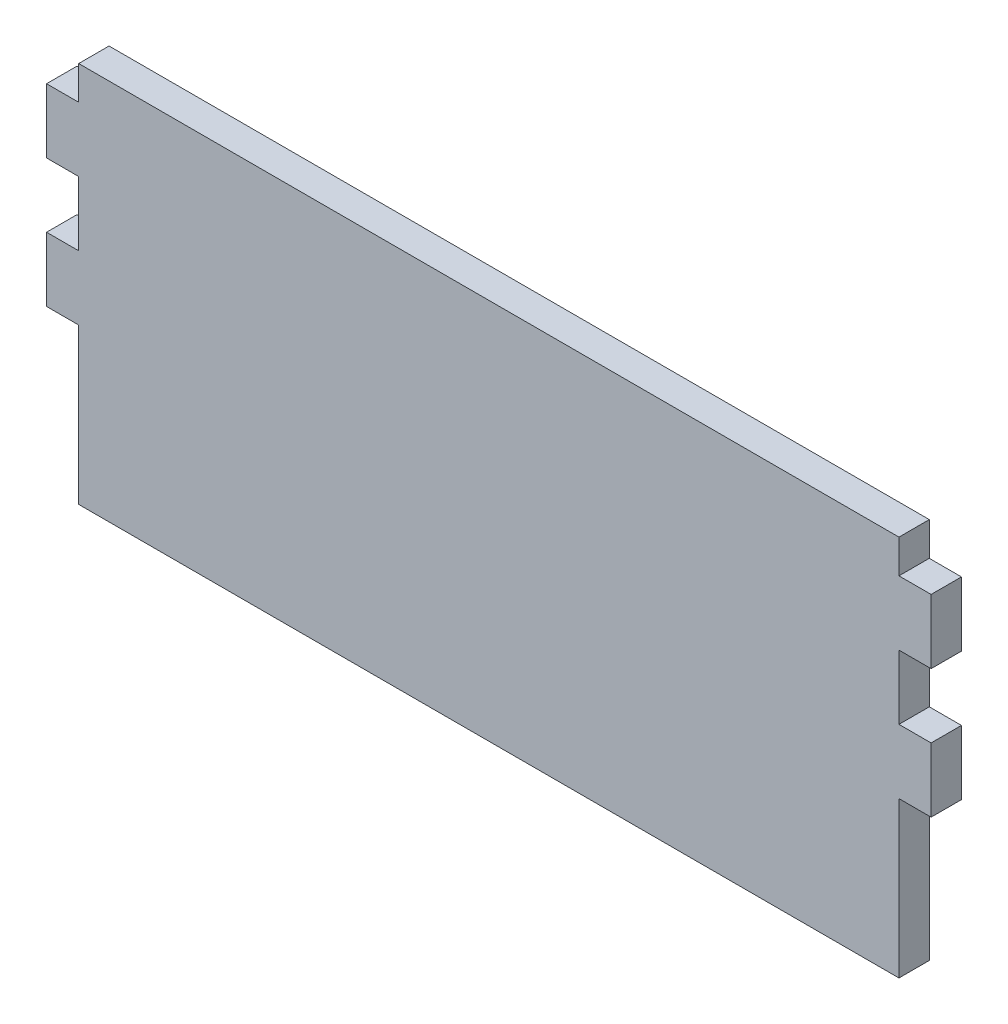
ISO-10303-21;
HEADER;
FILE_DESCRIPTION(('STEP AP214'),'2;1');
FILE_NAME('part.step','',(''),(''),'','','');
FILE_SCHEMA(('AUTOMOTIVE_DESIGN { 1 0 10303 214 1 1 1 1 }'));
ENDSEC;
DATA;
#1=APPLICATION_CONTEXT('core data for automotive mechanical design processes');
#2=APPLICATION_PROTOCOL_DEFINITION('international standard','automotive_design',2000,#1);
#3=PRODUCT_CONTEXT('',#1,'mechanical');
#4=PRODUCT('Part','Part','',(#3));
#5=PRODUCT_RELATED_PRODUCT_CATEGORY('part','',(#4));
#6=PRODUCT_DEFINITION_FORMATION('','',#4);
#7=PRODUCT_DEFINITION_CONTEXT('part definition',#1,'design');
#8=PRODUCT_DEFINITION('design','',#6,#7);
#9=PRODUCT_DEFINITION_SHAPE('','',#8);
#10=(LENGTH_UNIT() NAMED_UNIT(*) SI_UNIT(.MILLI.,.METRE.));
#11=(NAMED_UNIT(*) PLANE_ANGLE_UNIT() SI_UNIT($,.RADIAN.));
#12=(NAMED_UNIT(*) SI_UNIT($,.STERADIAN.) SOLID_ANGLE_UNIT());
#13=UNCERTAINTY_MEASURE_WITH_UNIT(LENGTH_MEASURE(1.E-05),#10,'distance_accuracy_value','');
#14=(GEOMETRIC_REPRESENTATION_CONTEXT(3) GLOBAL_UNCERTAINTY_ASSIGNED_CONTEXT((#13)) GLOBAL_UNIT_ASSIGNED_CONTEXT((#10,
#11,#12)) REPRESENTATION_CONTEXT('',''));
#15=CARTESIAN_POINT('',(0.,0.,0.));
#16=DIRECTION('',(0.,0.,1.));
#17=DIRECTION('',(1.,0.,0.));
#18=AXIS2_PLACEMENT_3D('',#15,#16,#17);
#19=CARTESIAN_POINT('',(81.,0.,2.9972));
#20=DIRECTION('',(0.,1.,0.));
#21=DIRECTION('',(0.,0.,1.));
#22=AXIS2_PLACEMENT_3D('',#19,#20,#21);
#23=PLANE('',#22);
#24=DIRECTION('',(1.,0.,0.));
#25=VECTOR('',#24,1.);
#26=CARTESIAN_POINT('',(81.,0.,0.));
#27=LINE('',#26,#25);
#28=CARTESIAN_POINT('',(0.,0.,0.));
#29=VERTEX_POINT('',#28);
#30=CARTESIAN_POINT('',(81.,0.,0.));
#31=VERTEX_POINT('',#30);
#32=EDGE_CURVE('E201',#29,#31,#27,.T.);
#33=ORIENTED_EDGE('',*,*,#32,.T.);
#34=DIRECTION('',(0.,0.,-1.));
#35=VECTOR('',#34,1.);
#36=CARTESIAN_POINT('',(81.,0.,2.9972));
#37=LINE('',#36,#35);
#38=CARTESIAN_POINT('',(81.,0.,2.9972));
#39=VERTEX_POINT('',#38);
#40=EDGE_CURVE('E11',#39,#31,#37,.T.);
#41=ORIENTED_EDGE('',*,*,#40,.F.);
#42=DIRECTION('',(1.,0.,0.));
#43=VECTOR('',#42,1.);
#44=CARTESIAN_POINT('',(81.,0.,2.9972));
#45=LINE('',#44,#43);
#46=CARTESIAN_POINT('',(0.,0.,2.9972));
#47=VERTEX_POINT('',#46);
#48=EDGE_CURVE('E239',#47,#39,#45,.T.);
#49=ORIENTED_EDGE('',*,*,#48,.F.);
#50=DIRECTION('',(0.,0.,-1.));
#51=VECTOR('',#50,1.);
#52=CARTESIAN_POINT('',(0.,0.,2.9972));
#53=LINE('',#52,#51);
#54=EDGE_CURVE('E197',#47,#29,#53,.T.);
#55=ORIENTED_EDGE('',*,*,#54,.T.);
#56=EDGE_LOOP('',(#33,#41,#49,#55));
#57=FACE_BOUND('',#56,.T.);
#58=ADVANCED_FACE('F33',(#57),#23,.F.);
#59=CARTESIAN_POINT('',(81.,0.,2.9972));
#60=DIRECTION('',(-1.,0.,0.));
#61=DIRECTION('',(0.,-1.,0.));
#62=AXIS2_PLACEMENT_3D('',#59,#60,#61);
#63=PLANE('',#62);
#64=DIRECTION('',(0.,1.,0.));
#65=VECTOR('',#64,1.);
#66=CARTESIAN_POINT('',(81.,0.,0.));
#67=LINE('',#66,#65);
#68=CARTESIAN_POINT('',(81.,15.3413028,0.));
#69=VERTEX_POINT('',#68);
#70=EDGE_CURVE('E204',#31,#69,#67,.T.);
#71=ORIENTED_EDGE('',*,*,#70,.T.);
#72=DIRECTION('',(0.,0.,-1.));
#73=VECTOR('',#72,1.);
#74=CARTESIAN_POINT('',(81.,15.3413028,2.9972));
#75=LINE('',#74,#73);
#76=CARTESIAN_POINT('',(81.,15.3413028,2.9972));
#77=VERTEX_POINT('',#76);
#78=EDGE_CURVE('E41',#77,#69,#75,.T.);
#79=ORIENTED_EDGE('',*,*,#78,.F.);
#80=DIRECTION('',(0.,1.,0.));
#81=VECTOR('',#80,1.);
#82=CARTESIAN_POINT('',(81.,0.,2.9972));
#83=LINE('',#82,#81);
#84=EDGE_CURVE('E128',#39,#77,#83,.T.);
#85=ORIENTED_EDGE('',*,*,#84,.F.);
#86=ORIENTED_EDGE('',*,*,#40,.T.);
#87=EDGE_LOOP('',(#71,#79,#85,#86));
#88=FACE_BOUND('',#87,.T.);
#89=ADVANCED_FACE('F357',(#88),#63,.F.);
#90=CARTESIAN_POINT('',(81.,15.3413028,2.9972));
#91=DIRECTION('',(0.,1.,0.));
#92=DIRECTION('',(-1.,0.,0.));
#93=AXIS2_PLACEMENT_3D('',#90,#91,#92);
#94=PLANE('',#93);
#95=DIRECTION('',(1.,0.,0.));
#96=VECTOR('',#95,1.);
#97=CARTESIAN_POINT('',(81.,15.3413028,0.));
#98=LINE('',#97,#96);
#99=CARTESIAN_POINT('',(84.175,15.3413028,0.));
#100=VERTEX_POINT('',#99);
#101=EDGE_CURVE('E206',#69,#100,#98,.T.);
#102=ORIENTED_EDGE('',*,*,#101,.T.);
#103=DIRECTION('',(0.,0.,-1.));
#104=VECTOR('',#103,1.);
#105=CARTESIAN_POINT('',(84.175,15.3413028,2.9972));
#106=LINE('',#105,#104);
#107=CARTESIAN_POINT('',(84.175,15.3413028,2.9972));
#108=VERTEX_POINT('',#107);
#109=EDGE_CURVE('E282',#108,#100,#106,.T.);
#110=ORIENTED_EDGE('',*,*,#109,.F.);
#111=DIRECTION('',(1.,0.,0.));
#112=VECTOR('',#111,1.);
#113=CARTESIAN_POINT('',(81.,15.3413028,2.9972));
#114=LINE('',#113,#112);
#115=EDGE_CURVE('E290',#77,#108,#114,.T.);
#116=ORIENTED_EDGE('',*,*,#115,.F.);
#117=ORIENTED_EDGE('',*,*,#78,.T.);
#118=EDGE_LOOP('',(#102,#110,#116,#117));
#119=FACE_BOUND('',#118,.T.);
#120=ADVANCED_FACE('F288',(#119),#94,.F.);
#121=CARTESIAN_POINT('',(84.175,15.3413028,2.9972));
#122=DIRECTION('',(-1.,0.,0.));
#123=DIRECTION('',(0.,0.,1.));
#124=AXIS2_PLACEMENT_3D('',#121,#122,#123);
#125=PLANE('',#124);
#126=DIRECTION('',(0.,1.,0.));
#127=VECTOR('',#126,1.);
#128=CARTESIAN_POINT('',(84.175,15.3413028,0.));
#129=LINE('',#128,#127);
#130=CARTESIAN_POINT('',(84.175,21.6913028,0.));
#131=VERTEX_POINT('',#130);
#132=EDGE_CURVE('E208',#100,#131,#129,.T.);
#133=ORIENTED_EDGE('',*,*,#132,.T.);
#134=DIRECTION('',(0.,0.,-1.));
#135=VECTOR('',#134,1.);
#136=CARTESIAN_POINT('',(84.175,21.6913028,2.9972));
#137=LINE('',#136,#135);
#138=CARTESIAN_POINT('',(84.175,21.6913028,2.9972));
#139=VERTEX_POINT('',#138);
#140=EDGE_CURVE('E279',#139,#131,#137,.T.);
#141=ORIENTED_EDGE('',*,*,#140,.F.);
#142=DIRECTION('',(0.,1.,0.));
#143=VECTOR('',#142,1.);
#144=CARTESIAN_POINT('',(84.175,15.3413028,2.9972));
#145=LINE('',#144,#143);
#146=EDGE_CURVE('E308',#108,#139,#145,.T.);
#147=ORIENTED_EDGE('',*,*,#146,.F.);
#148=ORIENTED_EDGE('',*,*,#109,.T.);
#149=EDGE_LOOP('',(#133,#141,#147,#148));
#150=FACE_BOUND('',#149,.T.);
#151=ADVANCED_FACE('F299',(#150),#125,.F.);
#152=CARTESIAN_POINT('',(84.175,21.6913028,2.9972));
#153=DIRECTION('',(0.,-1.,0.));
#154=DIRECTION('',(0.,0.,-1.));
#155=AXIS2_PLACEMENT_3D('',#152,#153,#154);
#156=PLANE('',#155);
#157=DIRECTION('',(-1.,0.,0.));
#158=VECTOR('',#157,1.);
#159=CARTESIAN_POINT('',(84.175,21.6913028,0.));
#160=LINE('',#159,#158);
#161=CARTESIAN_POINT('',(81.,21.6913028,0.));
#162=VERTEX_POINT('',#161);
#163=EDGE_CURVE('E210',#131,#162,#160,.T.);
#164=ORIENTED_EDGE('',*,*,#163,.T.);
#165=DIRECTION('',(0.,0.,-1.));
#166=VECTOR('',#165,1.);
#167=CARTESIAN_POINT('',(81.,21.6913028,2.9972));
#168=LINE('',#167,#166);
#169=CARTESIAN_POINT('',(81.,21.6913028,2.9972));
#170=VERTEX_POINT('',#169);
#171=EDGE_CURVE('E276',#170,#162,#168,.T.);
#172=ORIENTED_EDGE('',*,*,#171,.F.);
#173=DIRECTION('',(-1.,0.,0.));
#174=VECTOR('',#173,1.);
#175=CARTESIAN_POINT('',(84.175,21.6913028,2.9972));
#176=LINE('',#175,#174);
#177=EDGE_CURVE('E305',#139,#170,#176,.T.);
#178=ORIENTED_EDGE('',*,*,#177,.F.);
#179=ORIENTED_EDGE('',*,*,#140,.T.);
#180=EDGE_LOOP('',(#164,#172,#178,#179));
#181=FACE_BOUND('',#180,.T.);
#182=ADVANCED_FACE('F303',(#181),#156,.F.);
#183=CARTESIAN_POINT('',(81.,21.6913028,2.9972));
#184=DIRECTION('',(-1.,0.,0.));
#185=DIRECTION('',(0.,0.,1.));
#186=AXIS2_PLACEMENT_3D('',#183,#184,#185);
#187=PLANE('',#186);
#188=DIRECTION('',(0.,1.,0.));
#189=VECTOR('',#188,1.);
#190=CARTESIAN_POINT('',(81.,21.6913028,0.));
#191=LINE('',#190,#189);
#192=CARTESIAN_POINT('',(81.,28.0413028,0.));
#193=VERTEX_POINT('',#192);
#194=EDGE_CURVE('E212',#162,#193,#191,.T.);
#195=ORIENTED_EDGE('',*,*,#194,.T.);
#196=DIRECTION('',(0.,0.,-1.));
#197=VECTOR('',#196,1.);
#198=CARTESIAN_POINT('',(81.,28.0413028,2.9972));
#199=LINE('',#198,#197);
#200=CARTESIAN_POINT('',(81.,28.0413028,2.9972));
#201=VERTEX_POINT('',#200);
#202=EDGE_CURVE('E273',#201,#193,#199,.T.);
#203=ORIENTED_EDGE('',*,*,#202,.F.);
#204=DIRECTION('',(0.,1.,0.));
#205=VECTOR('',#204,1.);
#206=CARTESIAN_POINT('',(81.,21.6913028,2.9972));
#207=LINE('',#206,#205);
#208=EDGE_CURVE('E307',#170,#201,#207,.T.);
#209=ORIENTED_EDGE('',*,*,#208,.F.);
#210=ORIENTED_EDGE('',*,*,#171,.T.);
#211=EDGE_LOOP('',(#195,#203,#209,#210));
#212=FACE_BOUND('',#211,.T.);
#213=ADVANCED_FACE('F370',(#212),#187,.F.);
#214=CARTESIAN_POINT('',(81.,28.0413028,2.9972));
#215=DIRECTION('',(0.,1.,0.));
#216=DIRECTION('',(0.,0.,1.));
#217=AXIS2_PLACEMENT_3D('',#214,#215,#216);
#218=PLANE('',#217);
#219=DIRECTION('',(1.,0.,0.));
#220=VECTOR('',#219,1.);
#221=CARTESIAN_POINT('',(81.,28.0413028,0.));
#222=LINE('',#221,#220);
#223=CARTESIAN_POINT('',(84.175,28.0413028,0.));
#224=VERTEX_POINT('',#223);
#225=EDGE_CURVE('E214',#193,#224,#222,.T.);
#226=ORIENTED_EDGE('',*,*,#225,.T.);
#227=DIRECTION('',(0.,0.,-1.));
#228=VECTOR('',#227,1.);
#229=CARTESIAN_POINT('',(84.175,28.0413028,2.9972));
#230=LINE('',#229,#228);
#231=CARTESIAN_POINT('',(84.175,28.0413028,2.9972));
#232=VERTEX_POINT('',#231);
#233=EDGE_CURVE('E270',#232,#224,#230,.T.);
#234=ORIENTED_EDGE('',*,*,#233,.F.);
#235=DIRECTION('',(1.,0.,0.));
#236=VECTOR('',#235,1.);
#237=CARTESIAN_POINT('',(81.,28.0413028,2.9972));
#238=LINE('',#237,#236);
#239=EDGE_CURVE('E310',#201,#232,#238,.T.);
#240=ORIENTED_EDGE('',*,*,#239,.F.);
#241=ORIENTED_EDGE('',*,*,#202,.T.);
#242=EDGE_LOOP('',(#226,#234,#240,#241));
#243=FACE_BOUND('',#242,.T.);
#244=ADVANCED_FACE('F373',(#243),#218,.F.);
#245=CARTESIAN_POINT('',(84.175,28.0413028,2.9972));
#246=DIRECTION('',(-1.,0.,0.));
#247=DIRECTION('',(0.,0.,1.));
#248=AXIS2_PLACEMENT_3D('',#245,#246,#247);
#249=PLANE('',#248);
#250=DIRECTION('',(0.,1.,0.));
#251=VECTOR('',#250,1.);
#252=CARTESIAN_POINT('',(84.175,28.0413028,0.));
#253=LINE('',#252,#251);
#254=CARTESIAN_POINT('',(84.175,34.3913028,0.));
#255=VERTEX_POINT('',#254);
#256=EDGE_CURVE('E216',#224,#255,#253,.T.);
#257=ORIENTED_EDGE('',*,*,#256,.T.);
#258=DIRECTION('',(0.,0.,-1.));
#259=VECTOR('',#258,1.);
#260=CARTESIAN_POINT('',(84.175,34.3913028,2.9972));
#261=LINE('',#260,#259);
#262=CARTESIAN_POINT('',(84.175,34.3913028,2.9972));
#263=VERTEX_POINT('',#262);
#264=EDGE_CURVE('E267',#263,#255,#261,.T.);
#265=ORIENTED_EDGE('',*,*,#264,.F.);
#266=DIRECTION('',(0.,1.,0.));
#267=VECTOR('',#266,1.);
#268=CARTESIAN_POINT('',(84.175,28.0413028,2.9972));
#269=LINE('',#268,#267);
#270=EDGE_CURVE('E316',#232,#263,#269,.T.);
#271=ORIENTED_EDGE('',*,*,#270,.F.);
#272=ORIENTED_EDGE('',*,*,#233,.T.);
#273=EDGE_LOOP('',(#257,#265,#271,#272));
#274=FACE_BOUND('',#273,.T.);
#275=ADVANCED_FACE('F377',(#274),#249,.F.);
#276=CARTESIAN_POINT('',(84.175,34.3913028,2.9972));
#277=DIRECTION('',(0.,-1.,0.));
#278=DIRECTION('',(1.,0.,0.));
#279=AXIS2_PLACEMENT_3D('',#276,#277,#278);
#280=PLANE('',#279);
#281=DIRECTION('',(-1.,0.,0.));
#282=VECTOR('',#281,1.);
#283=CARTESIAN_POINT('',(84.175,34.3913028,0.));
#284=LINE('',#283,#282);
#285=CARTESIAN_POINT('',(81.,34.3913028,0.));
#286=VERTEX_POINT('',#285);
#287=EDGE_CURVE('E218',#255,#286,#284,.T.);
#288=ORIENTED_EDGE('',*,*,#287,.T.);
#289=DIRECTION('',(0.,0.,-1.));
#290=VECTOR('',#289,1.);
#291=CARTESIAN_POINT('',(81.,34.3913028,2.9972));
#292=LINE('',#291,#290);
#293=CARTESIAN_POINT('',(81.,34.3913028,2.9972));
#294=VERTEX_POINT('',#293);
#295=EDGE_CURVE('E264',#294,#286,#292,.T.);
#296=ORIENTED_EDGE('',*,*,#295,.F.);
#297=DIRECTION('',(-1.,0.,0.));
#298=VECTOR('',#297,1.);
#299=CARTESIAN_POINT('',(84.175,34.3913028,2.9972));
#300=LINE('',#299,#298);
#301=EDGE_CURVE('E318',#263,#294,#300,.T.);
#302=ORIENTED_EDGE('',*,*,#301,.F.);
#303=ORIENTED_EDGE('',*,*,#264,.T.);
#304=EDGE_LOOP('',(#288,#296,#302,#303));
#305=FACE_BOUND('',#304,.T.);
#306=ADVANCED_FACE('F381',(#305),#280,.F.);
#307=CARTESIAN_POINT('',(81.,34.3913028,2.9972));
#308=DIRECTION('',(-1.,0.,0.));
#309=DIRECTION('',(0.,0.,1.));
#310=AXIS2_PLACEMENT_3D('',#307,#308,#309);
#311=PLANE('',#310);
#312=DIRECTION('',(0.,1.,0.));
#313=VECTOR('',#312,1.);
#314=CARTESIAN_POINT('',(81.,34.3913028,0.));
#315=LINE('',#314,#313);
#316=CARTESIAN_POINT('',(81.,37.705820936,0.));
#317=VERTEX_POINT('',#316);
#318=EDGE_CURVE('E220',#286,#317,#315,.T.);
#319=ORIENTED_EDGE('',*,*,#318,.T.);
#320=DIRECTION('',(0.,0.,-1.));
#321=VECTOR('',#320,1.);
#322=CARTESIAN_POINT('',(81.,37.705820936,2.9972));
#323=LINE('',#322,#321);
#324=CARTESIAN_POINT('',(81.,37.705820936,2.9972));
#325=VERTEX_POINT('',#324);
#326=EDGE_CURVE('E261',#325,#317,#323,.T.);
#327=ORIENTED_EDGE('',*,*,#326,.F.);
#328=DIRECTION('',(0.,1.,0.));
#329=VECTOR('',#328,1.);
#330=CARTESIAN_POINT('',(81.,34.3913028,2.9972));
#331=LINE('',#330,#329);
#332=EDGE_CURVE('E320',#294,#325,#331,.T.);
#333=ORIENTED_EDGE('',*,*,#332,.F.);
#334=ORIENTED_EDGE('',*,*,#295,.T.);
#335=EDGE_LOOP('',(#319,#327,#333,#334));
#336=FACE_BOUND('',#335,.T.);
#337=ADVANCED_FACE('F385',(#336),#311,.F.);
#338=CARTESIAN_POINT('',(0.,37.705820936,2.9972));
#339=DIRECTION('',(0.,-1.,0.));
#340=DIRECTION('',(1.,0.,0.));
#341=AXIS2_PLACEMENT_3D('',#338,#339,#340);
#342=PLANE('',#341);
#343=DIRECTION('',(-1.,0.,0.));
#344=VECTOR('',#343,1.);
#345=CARTESIAN_POINT('',(0.,37.705820936,0.));
#346=LINE('',#345,#344);
#347=CARTESIAN_POINT('',(0.,37.705820936,0.));
#348=VERTEX_POINT('',#347);
#349=EDGE_CURVE('E222',#317,#348,#346,.T.);
#350=ORIENTED_EDGE('',*,*,#349,.T.);
#351=DIRECTION('',(0.,0.,-1.));
#352=VECTOR('',#351,1.);
#353=CARTESIAN_POINT('',(0.,37.705820936,2.9972));
#354=LINE('',#353,#352);
#355=CARTESIAN_POINT('',(0.,37.705820936,2.9972));
#356=VERTEX_POINT('',#355);
#357=EDGE_CURVE('E258',#356,#348,#354,.T.);
#358=ORIENTED_EDGE('',*,*,#357,.F.);
#359=DIRECTION('',(-1.,0.,0.));
#360=VECTOR('',#359,1.);
#361=CARTESIAN_POINT('',(0.,37.705820936,2.9972));
#362=LINE('',#361,#360);
#363=EDGE_CURVE('E322',#325,#356,#362,.T.);
#364=ORIENTED_EDGE('',*,*,#363,.F.);
#365=ORIENTED_EDGE('',*,*,#326,.T.);
#366=EDGE_LOOP('',(#350,#358,#364,#365));
#367=FACE_BOUND('',#366,.T.);
#368=ADVANCED_FACE('F389',(#367),#342,.F.);
#369=CARTESIAN_POINT('',(0.,34.3913028,2.9972));
#370=DIRECTION('',(1.,0.,0.));
#371=DIRECTION('',(0.,0.,-1.));
#372=AXIS2_PLACEMENT_3D('',#369,#370,#371);
#373=PLANE('',#372);
#374=DIRECTION('',(0.,-1.,0.));
#375=VECTOR('',#374,1.);
#376=CARTESIAN_POINT('',(0.,34.3913028,0.));
#377=LINE('',#376,#375);
#378=CARTESIAN_POINT('',(0.,34.3913028,0.));
#379=VERTEX_POINT('',#378);
#380=EDGE_CURVE('E224',#348,#379,#377,.T.);
#381=ORIENTED_EDGE('',*,*,#380,.T.);
#382=DIRECTION('',(0.,0.,-1.));
#383=VECTOR('',#382,1.);
#384=CARTESIAN_POINT('',(0.,34.3913028,2.9972));
#385=LINE('',#384,#383);
#386=CARTESIAN_POINT('',(0.,34.3913028,2.9972));
#387=VERTEX_POINT('',#386);
#388=EDGE_CURVE('E255',#387,#379,#385,.T.);
#389=ORIENTED_EDGE('',*,*,#388,.F.);
#390=DIRECTION('',(0.,-1.,0.));
#391=VECTOR('',#390,1.);
#392=CARTESIAN_POINT('',(0.,34.3913028,2.9972));
#393=LINE('',#392,#391);
#394=EDGE_CURVE('E324',#356,#387,#393,.T.);
#395=ORIENTED_EDGE('',*,*,#394,.F.);
#396=ORIENTED_EDGE('',*,*,#357,.T.);
#397=EDGE_LOOP('',(#381,#389,#395,#396));
#398=FACE_BOUND('',#397,.T.);
#399=ADVANCED_FACE('F393',(#398),#373,.F.);
#400=CARTESIAN_POINT('',(-3.175,34.3913028,2.9972));
#401=DIRECTION('',(0.,-1.,0.));
#402=DIRECTION('',(0.,0.,-1.));
#403=AXIS2_PLACEMENT_3D('',#400,#401,#402);
#404=PLANE('',#403);
#405=DIRECTION('',(-1.,0.,0.));
#406=VECTOR('',#405,1.);
#407=CARTESIAN_POINT('',(-3.175,34.3913028,0.));
#408=LINE('',#407,#406);
#409=CARTESIAN_POINT('',(-3.175,34.3913028,0.));
#410=VERTEX_POINT('',#409);
#411=EDGE_CURVE('E226',#379,#410,#408,.T.);
#412=ORIENTED_EDGE('',*,*,#411,.T.);
#413=DIRECTION('',(0.,0.,-1.));
#414=VECTOR('',#413,1.);
#415=CARTESIAN_POINT('',(-3.175,34.3913028,2.9972));
#416=LINE('',#415,#414);
#417=CARTESIAN_POINT('',(-3.175,34.3913028,2.9972));
#418=VERTEX_POINT('',#417);
#419=EDGE_CURVE('E252',#418,#410,#416,.T.);
#420=ORIENTED_EDGE('',*,*,#419,.F.);
#421=DIRECTION('',(-1.,0.,0.));
#422=VECTOR('',#421,1.);
#423=CARTESIAN_POINT('',(-3.175,34.3913028,2.9972));
#424=LINE('',#423,#422);
#425=EDGE_CURVE('E326',#387,#418,#424,.T.);
#426=ORIENTED_EDGE('',*,*,#425,.F.);
#427=ORIENTED_EDGE('',*,*,#388,.T.);
#428=EDGE_LOOP('',(#412,#420,#426,#427));
#429=FACE_BOUND('',#428,.T.);
#430=ADVANCED_FACE('F397',(#429),#404,.F.);
#431=CARTESIAN_POINT('',(-3.175,28.0413028,2.9972));
#432=DIRECTION('',(1.,0.,0.));
#433=DIRECTION('',(0.,1.,0.));
#434=AXIS2_PLACEMENT_3D('',#431,#432,#433);
#435=PLANE('',#434);
#436=DIRECTION('',(0.,-1.,0.));
#437=VECTOR('',#436,1.);
#438=CARTESIAN_POINT('',(-3.175,28.0413028,0.));
#439=LINE('',#438,#437);
#440=CARTESIAN_POINT('',(-3.175,28.0413028,0.));
#441=VERTEX_POINT('',#440);
#442=EDGE_CURVE('E228',#410,#441,#439,.T.);
#443=ORIENTED_EDGE('',*,*,#442,.T.);
#444=DIRECTION('',(0.,0.,-1.));
#445=VECTOR('',#444,1.);
#446=CARTESIAN_POINT('',(-3.175,28.0413028,2.9972));
#447=LINE('',#446,#445);
#448=CARTESIAN_POINT('',(-3.175,28.0413028,2.9972));
#449=VERTEX_POINT('',#448);
#450=EDGE_CURVE('E249',#449,#441,#447,.T.);
#451=ORIENTED_EDGE('',*,*,#450,.F.);
#452=DIRECTION('',(0.,-1.,0.));
#453=VECTOR('',#452,1.);
#454=CARTESIAN_POINT('',(-3.175,28.0413028,2.9972));
#455=LINE('',#454,#453);
#456=EDGE_CURVE('E328',#418,#449,#455,.T.);
#457=ORIENTED_EDGE('',*,*,#456,.F.);
#458=ORIENTED_EDGE('',*,*,#419,.T.);
#459=EDGE_LOOP('',(#443,#451,#457,#458));
#460=FACE_BOUND('',#459,.T.);
#461=ADVANCED_FACE('F401',(#460),#435,.F.);
#462=CARTESIAN_POINT('',(0.,28.0413028,2.9972));
#463=DIRECTION('',(0.,1.,0.));
#464=DIRECTION('',(0.,0.,1.));
#465=AXIS2_PLACEMENT_3D('',#462,#463,#464);
#466=PLANE('',#465);
#467=DIRECTION('',(1.,0.,0.));
#468=VECTOR('',#467,1.);
#469=CARTESIAN_POINT('',(0.,28.0413028,0.));
#470=LINE('',#469,#468);
#471=CARTESIAN_POINT('',(0.,28.0413028,0.));
#472=VERTEX_POINT('',#471);
#473=EDGE_CURVE('E230',#441,#472,#470,.T.);
#474=ORIENTED_EDGE('',*,*,#473,.T.);
#475=DIRECTION('',(0.,0.,-1.));
#476=VECTOR('',#475,1.);
#477=CARTESIAN_POINT('',(0.,28.0413028,2.9972));
#478=LINE('',#477,#476);
#479=CARTESIAN_POINT('',(0.,28.0413028,2.9972));
#480=VERTEX_POINT('',#479);
#481=EDGE_CURVE('E246',#480,#472,#478,.T.);
#482=ORIENTED_EDGE('',*,*,#481,.F.);
#483=DIRECTION('',(1.,0.,0.));
#484=VECTOR('',#483,1.);
#485=CARTESIAN_POINT('',(0.,28.0413028,2.9972));
#486=LINE('',#485,#484);
#487=EDGE_CURVE('E330',#449,#480,#486,.T.);
#488=ORIENTED_EDGE('',*,*,#487,.F.);
#489=ORIENTED_EDGE('',*,*,#450,.T.);
#490=EDGE_LOOP('',(#474,#482,#488,#489));
#491=FACE_BOUND('',#490,.T.);
#492=ADVANCED_FACE('F405',(#491),#466,.F.);
#493=CARTESIAN_POINT('',(0.,21.6913028,2.9972));
#494=DIRECTION('',(1.,0.,0.));
#495=DIRECTION('',(0.,0.,-1.));
#496=AXIS2_PLACEMENT_3D('',#493,#494,#495);
#497=PLANE('',#496);
#498=DIRECTION('',(0.,-1.,0.));
#499=VECTOR('',#498,1.);
#500=CARTESIAN_POINT('',(0.,21.6913028,0.));
#501=LINE('',#500,#499);
#502=CARTESIAN_POINT('',(0.,21.6913028,0.));
#503=VERTEX_POINT('',#502);
#504=EDGE_CURVE('E232',#472,#503,#501,.T.);
#505=ORIENTED_EDGE('',*,*,#504,.T.);
#506=DIRECTION('',(0.,0.,-1.));
#507=VECTOR('',#506,1.);
#508=CARTESIAN_POINT('',(0.,21.6913028,2.9972));
#509=LINE('',#508,#507);
#510=CARTESIAN_POINT('',(0.,21.6913028,2.9972));
#511=VERTEX_POINT('',#510);
#512=EDGE_CURVE('E243',#511,#503,#509,.T.);
#513=ORIENTED_EDGE('',*,*,#512,.F.);
#514=DIRECTION('',(0.,-1.,0.));
#515=VECTOR('',#514,1.);
#516=CARTESIAN_POINT('',(0.,21.6913028,2.9972));
#517=LINE('',#516,#515);
#518=EDGE_CURVE('E332',#480,#511,#517,.T.);
#519=ORIENTED_EDGE('',*,*,#518,.F.);
#520=ORIENTED_EDGE('',*,*,#481,.T.);
#521=EDGE_LOOP('',(#505,#513,#519,#520));
#522=FACE_BOUND('',#521,.T.);
#523=ADVANCED_FACE('F338',(#522),#497,.F.);
#524=CARTESIAN_POINT('',(-3.175,21.6913028,2.9972));
#525=DIRECTION('',(0.,-1.,0.));
#526=DIRECTION('',(0.,0.,-1.));
#527=AXIS2_PLACEMENT_3D('',#524,#525,#526);
#528=PLANE('',#527);
#529=DIRECTION('',(-1.,0.,0.));
#530=VECTOR('',#529,1.);
#531=CARTESIAN_POINT('',(-3.175,21.6913028,0.));
#532=LINE('',#531,#530);
#533=CARTESIAN_POINT('',(-3.175,21.6913028,0.));
#534=VERTEX_POINT('',#533);
#535=EDGE_CURVE('E234',#503,#534,#532,.T.);
#536=ORIENTED_EDGE('',*,*,#535,.T.);
#537=DIRECTION('',(0.,0.,-1.));
#538=VECTOR('',#537,1.);
#539=CARTESIAN_POINT('',(-3.175,21.6913028,2.9972));
#540=LINE('',#539,#538);
#541=CARTESIAN_POINT('',(-3.175,21.6913028,2.9972));
#542=VERTEX_POINT('',#541);
#543=EDGE_CURVE('E192',#542,#534,#540,.T.);
#544=ORIENTED_EDGE('',*,*,#543,.F.);
#545=DIRECTION('',(-1.,0.,0.));
#546=VECTOR('',#545,1.);
#547=CARTESIAN_POINT('',(-3.175,21.6913028,2.9972));
#548=LINE('',#547,#546);
#549=EDGE_CURVE('E183',#511,#542,#548,.T.);
#550=ORIENTED_EDGE('',*,*,#549,.F.);
#551=ORIENTED_EDGE('',*,*,#512,.T.);
#552=EDGE_LOOP('',(#536,#544,#550,#551));
#553=FACE_BOUND('',#552,.T.);
#554=ADVANCED_FACE('F342',(#553),#528,.F.);
#555=CARTESIAN_POINT('',(-3.175,15.3413028,2.9972));
#556=DIRECTION('',(1.,0.,0.));
#557=DIRECTION('',(0.,0.,-1.));
#558=AXIS2_PLACEMENT_3D('',#555,#556,#557);
#559=PLANE('',#558);
#560=DIRECTION('',(0.,-1.,0.));
#561=VECTOR('',#560,1.);
#562=CARTESIAN_POINT('',(-3.175,15.3413028,0.));
#563=LINE('',#562,#561);
#564=CARTESIAN_POINT('',(-3.175,15.3413028,0.));
#565=VERTEX_POINT('',#564);
#566=EDGE_CURVE('E191',#534,#565,#563,.T.);
#567=ORIENTED_EDGE('',*,*,#566,.T.);
#568=DIRECTION('',(0.,0.,-1.));
#569=VECTOR('',#568,1.);
#570=CARTESIAN_POINT('',(-3.175,15.3413028,2.9972));
#571=LINE('',#570,#569);
#572=CARTESIAN_POINT('',(-3.175,15.3413028,2.9972));
#573=VERTEX_POINT('',#572);
#574=EDGE_CURVE('E188',#573,#565,#571,.T.);
#575=ORIENTED_EDGE('',*,*,#574,.F.);
#576=DIRECTION('',(0.,-1.,0.));
#577=VECTOR('',#576,1.);
#578=CARTESIAN_POINT('',(-3.175,15.3413028,2.9972));
#579=LINE('',#578,#577);
#580=EDGE_CURVE('E177',#542,#573,#579,.T.);
#581=ORIENTED_EDGE('',*,*,#580,.F.);
#582=ORIENTED_EDGE('',*,*,#543,.T.);
#583=EDGE_LOOP('',(#567,#575,#581,#582));
#584=FACE_BOUND('',#583,.T.);
#585=ADVANCED_FACE('F189',(#584),#559,.F.);
#586=CARTESIAN_POINT('',(0.,15.3413028,2.9972));
#587=DIRECTION('',(0.,1.,0.));
#588=DIRECTION('',(-1.,0.,0.));
#589=AXIS2_PLACEMENT_3D('',#586,#587,#588);
#590=PLANE('',#589);
#591=DIRECTION('',(1.,0.,0.));
#592=VECTOR('',#591,1.);
#593=CARTESIAN_POINT('',(0.,15.3413028,0.));
#594=LINE('',#593,#592);
#595=CARTESIAN_POINT('',(0.,15.3413028,0.));
#596=VERTEX_POINT('',#595);
#597=EDGE_CURVE('E114',#565,#596,#594,.T.);
#598=ORIENTED_EDGE('',*,*,#597,.T.);
#599=DIRECTION('',(0.,0.,-1.));
#600=VECTOR('',#599,1.);
#601=CARTESIAN_POINT('',(0.,15.3413028,2.9972));
#602=LINE('',#601,#600);
#603=CARTESIAN_POINT('',(0.,15.3413028,2.9972));
#604=VERTEX_POINT('',#603);
#605=EDGE_CURVE('E193',#604,#596,#602,.T.);
#606=ORIENTED_EDGE('',*,*,#605,.F.);
#607=DIRECTION('',(1.,0.,0.));
#608=VECTOR('',#607,1.);
#609=CARTESIAN_POINT('',(0.,15.3413028,2.9972));
#610=LINE('',#609,#608);
#611=EDGE_CURVE('E181',#573,#604,#610,.T.);
#612=ORIENTED_EDGE('',*,*,#611,.F.);
#613=ORIENTED_EDGE('',*,*,#574,.T.);
#614=EDGE_LOOP('',(#598,#606,#612,#613));
#615=FACE_BOUND('',#614,.T.);
#616=ADVANCED_FACE('F195',(#615),#590,.F.);
#617=CARTESIAN_POINT('',(0.,0.,2.9972));
#618=DIRECTION('',(1.,0.,0.));
#619=DIRECTION('',(0.,0.,-1.));
#620=AXIS2_PLACEMENT_3D('',#617,#618,#619);
#621=PLANE('',#620);
#622=DIRECTION('',(0.,-1.,0.));
#623=VECTOR('',#622,1.);
#624=CARTESIAN_POINT('',(0.,0.,0.));
#625=LINE('',#624,#623);
#626=EDGE_CURVE('E120',#596,#29,#625,.T.);
#627=ORIENTED_EDGE('',*,*,#626,.T.);
#628=ORIENTED_EDGE('',*,*,#54,.F.);
#629=DIRECTION('',(0.,-1.,0.));
#630=VECTOR('',#629,1.);
#631=CARTESIAN_POINT('',(0.,0.,2.9972));
#632=LINE('',#631,#630);
#633=EDGE_CURVE('E49',#604,#47,#632,.T.);
#634=ORIENTED_EDGE('',*,*,#633,.F.);
#635=ORIENTED_EDGE('',*,*,#605,.T.);
#636=EDGE_LOOP('',(#627,#628,#634,#635));
#637=FACE_BOUND('',#636,.T.);
#638=ADVANCED_FACE('F346',(#637),#621,.F.);
#639=CARTESIAN_POINT('',(0.,0.,2.9972));
#640=DIRECTION('',(0.,0.,-1.));
#641=DIRECTION('',(-1.,0.,0.));
#642=AXIS2_PLACEMENT_3D('',#639,#640,#641);
#643=PLANE('',#642);
#644=ORIENTED_EDGE('',*,*,#48,.T.);
#645=ORIENTED_EDGE('',*,*,#84,.T.);
#646=ORIENTED_EDGE('',*,*,#115,.T.);
#647=ORIENTED_EDGE('',*,*,#146,.T.);
#648=ORIENTED_EDGE('',*,*,#177,.T.);
#649=ORIENTED_EDGE('',*,*,#208,.T.);
#650=ORIENTED_EDGE('',*,*,#239,.T.);
#651=ORIENTED_EDGE('',*,*,#270,.T.);
#652=ORIENTED_EDGE('',*,*,#301,.T.);
#653=ORIENTED_EDGE('',*,*,#332,.T.);
#654=ORIENTED_EDGE('',*,*,#363,.T.);
#655=ORIENTED_EDGE('',*,*,#394,.T.);
#656=ORIENTED_EDGE('',*,*,#425,.T.);
#657=ORIENTED_EDGE('',*,*,#456,.T.);
#658=ORIENTED_EDGE('',*,*,#487,.T.);
#659=ORIENTED_EDGE('',*,*,#518,.T.);
#660=ORIENTED_EDGE('',*,*,#549,.T.);
#661=ORIENTED_EDGE('',*,*,#580,.T.);
#662=ORIENTED_EDGE('',*,*,#611,.T.);
#663=ORIENTED_EDGE('',*,*,#633,.T.);
#664=EDGE_LOOP('',(#644,#645,#646,#647,#648,#649,#650,#651,#652,#653,#654,#655,#656,#657,#658,
#659,#660,#661,#662,#663));
#665=FACE_BOUND('',#664,.T.);
#666=ADVANCED_FACE('F179',(#665),#643,.F.);
#667=CARTESIAN_POINT('',(0.,0.,0.));
#668=DIRECTION('',(0.,0.,-1.));
#669=DIRECTION('',(-1.,0.,0.));
#670=AXIS2_PLACEMENT_3D('',#667,#668,#669);
#671=PLANE('',#670);
#672=ORIENTED_EDGE('',*,*,#32,.F.);
#673=ORIENTED_EDGE('',*,*,#626,.F.);
#674=ORIENTED_EDGE('',*,*,#597,.F.);
#675=ORIENTED_EDGE('',*,*,#566,.F.);
#676=ORIENTED_EDGE('',*,*,#535,.F.);
#677=ORIENTED_EDGE('',*,*,#504,.F.);
#678=ORIENTED_EDGE('',*,*,#473,.F.);
#679=ORIENTED_EDGE('',*,*,#442,.F.);
#680=ORIENTED_EDGE('',*,*,#411,.F.);
#681=ORIENTED_EDGE('',*,*,#380,.F.);
#682=ORIENTED_EDGE('',*,*,#349,.F.);
#683=ORIENTED_EDGE('',*,*,#318,.F.);
#684=ORIENTED_EDGE('',*,*,#287,.F.);
#685=ORIENTED_EDGE('',*,*,#256,.F.);
#686=ORIENTED_EDGE('',*,*,#225,.F.);
#687=ORIENTED_EDGE('',*,*,#194,.F.);
#688=ORIENTED_EDGE('',*,*,#163,.F.);
#689=ORIENTED_EDGE('',*,*,#132,.F.);
#690=ORIENTED_EDGE('',*,*,#101,.F.);
#691=ORIENTED_EDGE('',*,*,#70,.F.);
#692=EDGE_LOOP('',(#672,#673,#674,#675,#676,#677,#678,#679,#680,#681,#682,#683,#684,#685,#686,
#687,#688,#689,#690,#691));
#693=FACE_BOUND('',#692,.T.);
#694=ADVANCED_FACE('F294',(#693),#671,.T.);
#695=CLOSED_SHELL('',(#58,#89,#120,#151,#182,#213,#244,#275,#306,#337,#368,#399,#430,#461,#492,
#523,#554,#585,#616,#638,#666,#694));
#696=MANIFOLD_SOLID_BREP('B2',#695);
#697=ADVANCED_BREP_SHAPE_REPRESENTATION('',(#18,#696),#14);
#698=SHAPE_DEFINITION_REPRESENTATION(#9,#697);
ENDSEC;
END-ISO-10303-21;
